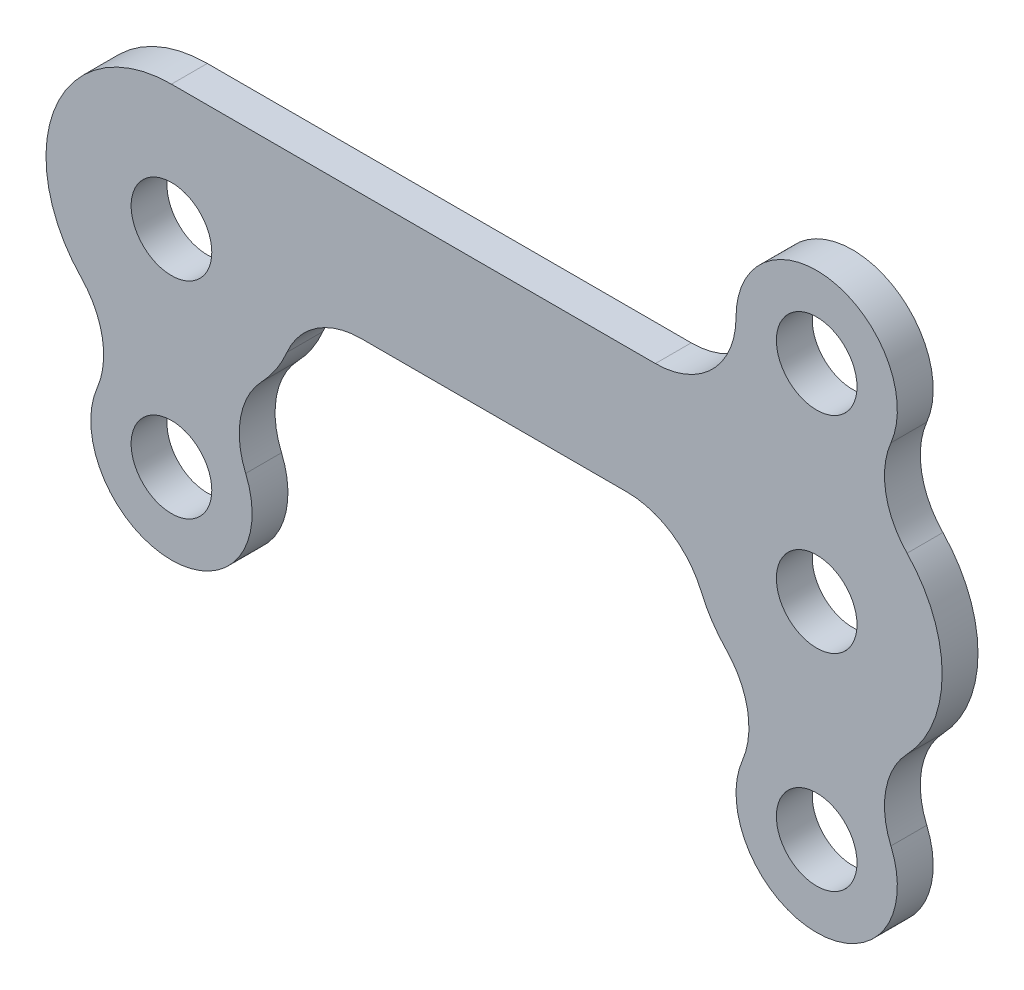
ISO-10303-21;
HEADER;
FILE_DESCRIPTION(('STEP AP214'),'2;1');
FILE_NAME('part.step','',(''),(''),'','','');
FILE_SCHEMA(('AUTOMOTIVE_DESIGN { 1 0 10303 214 1 1 1 1 }'));
ENDSEC;
DATA;
#1=APPLICATION_CONTEXT('core data for automotive mechanical design processes');
#2=APPLICATION_PROTOCOL_DEFINITION('international standard','automotive_design',2000,#1);
#3=PRODUCT_CONTEXT('',#1,'mechanical');
#4=PRODUCT('Part','Part','',(#3));
#5=PRODUCT_RELATED_PRODUCT_CATEGORY('part','',(#4));
#6=PRODUCT_DEFINITION_FORMATION('','',#4);
#7=PRODUCT_DEFINITION_CONTEXT('part definition',#1,'design');
#8=PRODUCT_DEFINITION('design','',#6,#7);
#9=PRODUCT_DEFINITION_SHAPE('','',#8);
#10=(LENGTH_UNIT() NAMED_UNIT(*) SI_UNIT(.MILLI.,.METRE.));
#11=(NAMED_UNIT(*) PLANE_ANGLE_UNIT() SI_UNIT($,.RADIAN.));
#12=(NAMED_UNIT(*) SI_UNIT($,.STERADIAN.) SOLID_ANGLE_UNIT());
#13=UNCERTAINTY_MEASURE_WITH_UNIT(LENGTH_MEASURE(1.E-05),#10,'distance_accuracy_value','');
#14=(GEOMETRIC_REPRESENTATION_CONTEXT(3) GLOBAL_UNCERTAINTY_ASSIGNED_CONTEXT((#13)) GLOBAL_UNIT_ASSIGNED_CONTEXT((#10,
#11,#12)) REPRESENTATION_CONTEXT('',''));
#15=CARTESIAN_POINT('',(0.,0.,0.));
#16=DIRECTION('',(0.,0.,1.));
#17=DIRECTION('',(1.,0.,0.));
#18=AXIS2_PLACEMENT_3D('',#15,#16,#17);
#19=CARTESIAN_POINT('',(35.149116844667,6.33274456521739,1.5875));
#20=DIRECTION('',(0.,0.,-1.));
#21=DIRECTION('',(-1.,0.,0.));
#22=AXIS2_PLACEMENT_3D('',#19,#20,#21);
#23=CYLINDRICAL_SURFACE('',#22,3.571875);
#24=CARTESIAN_POINT('',(35.149116844667,6.33274456521739,0.));
#25=DIRECTION('',(0.,0.,1.));
#26=DIRECTION('',(1.,0.,0.));
#27=AXIS2_PLACEMENT_3D('',#24,#25,#26);
#28=CIRCLE('',#27,3.571875);
#29=CARTESIAN_POINT('',(31.8620584223335,7.73043478260869,0.));
#30=VERTEX_POINT('',#29);
#31=CARTESIAN_POINT('',(32.5766363402321,3.8547140831758,0.));
#32=VERTEX_POINT('',#31);
#33=EDGE_CURVE('E166',#30,#32,#28,.T.);
#34=ORIENTED_EDGE('',*,*,#33,.F.);
#35=DIRECTION('',(0.,0.,-1.));
#36=VECTOR('',#35,1.);
#37=CARTESIAN_POINT('',(31.8620584223335,7.73043478260869,1.5875));
#38=LINE('',#37,#36);
#39=CARTESIAN_POINT('',(31.8620584223335,7.73043478260869,1.5875));
#40=VERTEX_POINT('',#39);
#41=EDGE_CURVE('E161',#40,#30,#38,.T.);
#42=ORIENTED_EDGE('',*,*,#41,.F.);
#43=CARTESIAN_POINT('',(35.149116844667,6.33274456521739,1.5875));
#44=DIRECTION('',(0.,0.,1.));
#45=DIRECTION('',(1.,0.,0.));
#46=AXIS2_PLACEMENT_3D('',#43,#44,#45);
#47=CIRCLE('',#46,3.571875);
#48=CARTESIAN_POINT('',(32.5766363402321,3.8547140831758,1.5875));
#49=VERTEX_POINT('',#48);
#50=EDGE_CURVE('E164',#40,#49,#47,.T.);
#51=ORIENTED_EDGE('',*,*,#50,.T.);
#52=DIRECTION('',(0.,0.,-1.));
#53=VECTOR('',#52,1.);
#54=CARTESIAN_POINT('',(32.5766363402321,3.8547140831758,1.5875));
#55=LINE('',#54,#53);
#56=EDGE_CURVE('E256',#49,#32,#55,.T.);
#57=ORIENTED_EDGE('',*,*,#56,.T.);
#58=EDGE_LOOP('',(#34,#42,#51,#57));
#59=FACE_BOUND('',#58,.T.);
#60=ADVANCED_FACE('F41',(#59),#23,.F.);
#61=CARTESIAN_POINT('',(28.575,9.128125,1.5875));
#62=DIRECTION('',(0.,0.,-1.));
#63=DIRECTION('',(-1.,0.,0.));
#64=AXIS2_PLACEMENT_3D('',#61,#62,#63);
#65=CYLINDRICAL_SURFACE('',#64,3.571875);
#66=CARTESIAN_POINT('',(28.575,9.128125,0.));
#67=DIRECTION('',(0.,0.,1.));
#68=DIRECTION('',(1.,0.,0.));
#69=AXIS2_PLACEMENT_3D('',#66,#67,#68);
#70=CIRCLE('',#69,3.571875);
#71=CARTESIAN_POINT('',(25.003125,9.128125,0.));
#72=VERTEX_POINT('',#71);
#73=EDGE_CURVE('E259',#30,#72,#70,.T.);
#74=ORIENTED_EDGE('',*,*,#73,.T.);
#75=DIRECTION('',(0.,0.,-1.));
#76=VECTOR('',#75,1.);
#77=CARTESIAN_POINT('',(25.003125,9.128125,1.5875));
#78=LINE('',#77,#76);
#79=CARTESIAN_POINT('',(25.003125,9.128125,1.5875));
#80=VERTEX_POINT('',#79);
#81=EDGE_CURVE('E172',#80,#72,#78,.T.);
#82=ORIENTED_EDGE('',*,*,#81,.F.);
#83=CARTESIAN_POINT('',(28.575,9.128125,1.5875));
#84=DIRECTION('',(0.,0.,1.));
#85=DIRECTION('',(1.,0.,0.));
#86=AXIS2_PLACEMENT_3D('',#83,#84,#85);
#87=CIRCLE('',#86,3.571875);
#88=EDGE_CURVE('E175',#40,#80,#87,.T.);
#89=ORIENTED_EDGE('',*,*,#88,.F.);
#90=ORIENTED_EDGE('',*,*,#41,.T.);
#91=EDGE_LOOP('',(#74,#82,#89,#90));
#92=FACE_BOUND('',#91,.T.);
#93=ADVANCED_FACE('F176',(#92),#65,.T.);
#94=CARTESIAN_POINT('',(21.43125,9.128125,1.5875));
#95=DIRECTION('',(0.,0.,-1.));
#96=DIRECTION('',(-1.,0.,0.));
#97=AXIS2_PLACEMENT_3D('',#94,#95,#96);
#98=CYLINDRICAL_SURFACE('',#97,3.571875);
#99=CARTESIAN_POINT('',(21.43125,9.128125,0.));
#100=DIRECTION('',(0.,0.,1.));
#101=DIRECTION('',(1.,0.,0.));
#102=AXIS2_PLACEMENT_3D('',#99,#100,#101);
#103=CIRCLE('',#102,3.571875);
#104=CARTESIAN_POINT('',(21.43125,5.55625,0.));
#105=VERTEX_POINT('',#104);
#106=EDGE_CURVE('E262',#105,#72,#103,.T.);
#107=ORIENTED_EDGE('',*,*,#106,.F.);
#108=DIRECTION('',(0.,0.,-1.));
#109=VECTOR('',#108,1.);
#110=CARTESIAN_POINT('',(21.43125,5.55625,1.5875));
#111=LINE('',#110,#109);
#112=CARTESIAN_POINT('',(21.43125,5.55625,1.5875));
#113=VERTEX_POINT('',#112);
#114=EDGE_CURVE('E352',#113,#105,#111,.T.);
#115=ORIENTED_EDGE('',*,*,#114,.F.);
#116=CARTESIAN_POINT('',(21.43125,9.128125,1.5875));
#117=DIRECTION('',(0.,0.,1.));
#118=DIRECTION('',(1.,0.,0.));
#119=AXIS2_PLACEMENT_3D('',#116,#117,#118);
#120=CIRCLE('',#119,3.571875);
#121=EDGE_CURVE('E181',#113,#80,#120,.T.);
#122=ORIENTED_EDGE('',*,*,#121,.T.);
#123=ORIENTED_EDGE('',*,*,#81,.T.);
#124=EDGE_LOOP('',(#107,#115,#122,#123));
#125=FACE_BOUND('',#124,.T.);
#126=ADVANCED_FACE('F417',(#125),#98,.F.);
#127=CARTESIAN_POINT('',(0.,5.55625,1.5875));
#128=DIRECTION('',(0.,1.,0.));
#129=DIRECTION('',(0.,0.,1.));
#130=AXIS2_PLACEMENT_3D('',#127,#128,#129);
#131=PLANE('',#130);
#132=DIRECTION('',(1.,0.,0.));
#133=VECTOR('',#132,1.);
#134=CARTESIAN_POINT('',(0.,5.55625,0.));
#135=LINE('',#134,#133);
#136=CARTESIAN_POINT('',(0.,5.55625,0.));
#137=VERTEX_POINT('',#136);
#138=EDGE_CURVE('E266',#137,#105,#135,.T.);
#139=ORIENTED_EDGE('',*,*,#138,.F.);
#140=DIRECTION('',(0.,0.,-1.));
#141=VECTOR('',#140,1.);
#142=CARTESIAN_POINT('',(0.,5.55625,1.5875));
#143=LINE('',#142,#141);
#144=CARTESIAN_POINT('',(0.,5.55625,1.5875));
#145=VERTEX_POINT('',#144);
#146=EDGE_CURVE('E349',#145,#137,#143,.T.);
#147=ORIENTED_EDGE('',*,*,#146,.F.);
#148=DIRECTION('',(1.,0.,0.));
#149=VECTOR('',#148,1.);
#150=CARTESIAN_POINT('',(0.,5.55625,1.5875));
#151=LINE('',#150,#149);
#152=EDGE_CURVE('E199',#145,#113,#151,.T.);
#153=ORIENTED_EDGE('',*,*,#152,.T.);
#154=ORIENTED_EDGE('',*,*,#114,.T.);
#155=EDGE_LOOP('',(#139,#147,#153,#154));
#156=FACE_BOUND('',#155,.T.);
#157=ADVANCED_FACE('F420',(#156),#131,.T.);
#158=CARTESIAN_POINT('',(0.,0.,1.5875));
#159=DIRECTION('',(0.,0.,-1.));
#160=DIRECTION('',(-1.,0.,0.));
#161=AXIS2_PLACEMENT_3D('',#158,#159,#160);
#162=CYLINDRICAL_SURFACE('',#161,5.55625);
#163=CARTESIAN_POINT('',(0.,0.,0.));
#164=DIRECTION('',(0.,0.,1.));
#165=DIRECTION('',(1.,0.,0.));
#166=AXIS2_PLACEMENT_3D('',#163,#164,#165);
#167=CIRCLE('',#166,5.55625);
#168=CARTESIAN_POINT('',(-4.0016363402321,-3.8547140831758,0.));
#169=VERTEX_POINT('',#168);
#170=EDGE_CURVE('E270',#137,#169,#167,.T.);
#171=ORIENTED_EDGE('',*,*,#170,.T.);
#172=DIRECTION('',(0.,0.,-1.));
#173=VECTOR('',#172,1.);
#174=CARTESIAN_POINT('',(-4.0016363402321,-3.8547140831758,1.5875));
#175=LINE('',#174,#173);
#176=CARTESIAN_POINT('',(-4.0016363402321,-3.8547140831758,1.5875));
#177=VERTEX_POINT('',#176);
#178=EDGE_CURVE('E346',#177,#169,#175,.T.);
#179=ORIENTED_EDGE('',*,*,#178,.F.);
#180=CARTESIAN_POINT('',(0.,0.,1.5875));
#181=DIRECTION('',(0.,0.,1.));
#182=DIRECTION('',(1.,0.,0.));
#183=AXIS2_PLACEMENT_3D('',#180,#181,#182);
#184=CIRCLE('',#183,5.55625);
#185=EDGE_CURVE('E203',#145,#177,#184,.T.);
#186=ORIENTED_EDGE('',*,*,#185,.F.);
#187=ORIENTED_EDGE('',*,*,#146,.T.);
#188=EDGE_LOOP('',(#171,#179,#186,#187));
#189=FACE_BOUND('',#188,.T.);
#190=ADVANCED_FACE('F424',(#189),#162,.T.);
#191=CARTESIAN_POINT('',(-6.57411684466701,-6.33274456521738,1.5875));
#192=DIRECTION('',(0.,0.,-1.));
#193=DIRECTION('',(-1.,0.,0.));
#194=AXIS2_PLACEMENT_3D('',#191,#192,#193);
#195=CYLINDRICAL_SURFACE('',#194,3.571875);
#196=CARTESIAN_POINT('',(-6.57411684466701,-6.33274456521738,0.));
#197=DIRECTION('',(0.,0.,1.));
#198=DIRECTION('',(1.,0.,0.));
#199=AXIS2_PLACEMENT_3D('',#196,#197,#198);
#200=CIRCLE('',#199,3.571875);
#201=CARTESIAN_POINT('',(-3.28705842233351,-7.73043478260869,0.));
#202=VERTEX_POINT('',#201);
#203=EDGE_CURVE('E274',#202,#169,#200,.T.);
#204=ORIENTED_EDGE('',*,*,#203,.F.);
#205=DIRECTION('',(0.,0.,-1.));
#206=VECTOR('',#205,1.);
#207=CARTESIAN_POINT('',(-3.28705842233351,-7.73043478260869,1.5875));
#208=LINE('',#207,#206);
#209=CARTESIAN_POINT('',(-3.28705842233351,-7.73043478260869,1.5875));
#210=VERTEX_POINT('',#209);
#211=EDGE_CURVE('E343',#210,#202,#208,.T.);
#212=ORIENTED_EDGE('',*,*,#211,.F.);
#213=CARTESIAN_POINT('',(-6.57411684466701,-6.33274456521738,1.5875));
#214=DIRECTION('',(0.,0.,1.));
#215=DIRECTION('',(1.,0.,0.));
#216=AXIS2_PLACEMENT_3D('',#213,#214,#215);
#217=CIRCLE('',#216,3.571875);
#218=EDGE_CURVE('E206',#210,#177,#217,.T.);
#219=ORIENTED_EDGE('',*,*,#218,.T.);
#220=ORIENTED_EDGE('',*,*,#178,.T.);
#221=EDGE_LOOP('',(#204,#212,#219,#220));
#222=FACE_BOUND('',#221,.T.);
#223=ADVANCED_FACE('F430',(#222),#195,.F.);
#224=CARTESIAN_POINT('',(0.,-9.128125,1.5875));
#225=DIRECTION('',(0.,0.,-1.));
#226=DIRECTION('',(-1.,0.,0.));
#227=AXIS2_PLACEMENT_3D('',#224,#225,#226);
#228=CYLINDRICAL_SURFACE('',#227,3.571875);
#229=CARTESIAN_POINT('',(0.,-9.128125,0.));
#230=DIRECTION('',(0.,0.,1.));
#231=DIRECTION('',(1.,0.,0.));
#232=AXIS2_PLACEMENT_3D('',#229,#230,#231);
#233=CIRCLE('',#232,3.571875);
#234=CARTESIAN_POINT('',(3.28705842233351,-7.73043478260869,0.));
#235=VERTEX_POINT('',#234);
#236=EDGE_CURVE('E279',#202,#235,#233,.T.);
#237=ORIENTED_EDGE('',*,*,#236,.T.);
#238=DIRECTION('',(0.,0.,-1.));
#239=VECTOR('',#238,1.);
#240=CARTESIAN_POINT('',(3.28705842233351,-7.73043478260869,1.5875));
#241=LINE('',#240,#239);
#242=CARTESIAN_POINT('',(3.28705842233351,-7.73043478260869,1.5875));
#243=VERTEX_POINT('',#242);
#244=EDGE_CURVE('E340',#243,#235,#241,.T.);
#245=ORIENTED_EDGE('',*,*,#244,.F.);
#246=CARTESIAN_POINT('',(0.,-9.128125,1.5875));
#247=DIRECTION('',(0.,0.,1.));
#248=DIRECTION('',(1.,0.,0.));
#249=AXIS2_PLACEMENT_3D('',#246,#247,#248);
#250=CIRCLE('',#249,3.571875);
#251=EDGE_CURVE('E211',#210,#243,#250,.T.);
#252=ORIENTED_EDGE('',*,*,#251,.F.);
#253=ORIENTED_EDGE('',*,*,#211,.T.);
#254=EDGE_LOOP('',(#237,#245,#252,#253));
#255=FACE_BOUND('',#254,.T.);
#256=ADVANCED_FACE('F433',(#255),#228,.T.);
#257=CARTESIAN_POINT('',(6.57411684466701,-6.33274456521738,1.5875));
#258=DIRECTION('',(0.,0.,-1.));
#259=DIRECTION('',(-1.,0.,0.));
#260=AXIS2_PLACEMENT_3D('',#257,#258,#259);
#261=CYLINDRICAL_SURFACE('',#260,3.571875);
#262=CARTESIAN_POINT('',(6.57411684466701,-6.33274456521738,0.));
#263=DIRECTION('',(0.,0.,1.));
#264=DIRECTION('',(1.,0.,0.));
#265=AXIS2_PLACEMENT_3D('',#262,#263,#264);
#266=CIRCLE('',#265,3.571875);
#267=CARTESIAN_POINT('',(4.0016363402321,-3.8547140831758,0.));
#268=VERTEX_POINT('',#267);
#269=EDGE_CURVE('E283',#268,#235,#266,.T.);
#270=ORIENTED_EDGE('',*,*,#269,.F.);
#271=DIRECTION('',(0.,0.,-1.));
#272=VECTOR('',#271,1.);
#273=CARTESIAN_POINT('',(4.0016363402321,-3.8547140831758,1.5875));
#274=LINE('',#273,#272);
#275=CARTESIAN_POINT('',(4.0016363402321,-3.8547140831758,1.5875));
#276=VERTEX_POINT('',#275);
#277=EDGE_CURVE('E337',#276,#268,#274,.T.);
#278=ORIENTED_EDGE('',*,*,#277,.F.);
#279=CARTESIAN_POINT('',(6.57411684466701,-6.33274456521738,1.5875));
#280=DIRECTION('',(0.,0.,1.));
#281=DIRECTION('',(1.,0.,0.));
#282=AXIS2_PLACEMENT_3D('',#279,#280,#281);
#283=CIRCLE('',#282,3.571875);
#284=EDGE_CURVE('E214',#276,#243,#283,.T.);
#285=ORIENTED_EDGE('',*,*,#284,.T.);
#286=ORIENTED_EDGE('',*,*,#244,.T.);
#287=EDGE_LOOP('',(#270,#278,#285,#286));
#288=FACE_BOUND('',#287,.T.);
#289=ADVANCED_FACE('F436',(#288),#261,.F.);
#290=CARTESIAN_POINT('',(5.11320199029657,-2.1741847826087,0.));
#291=VERTEX_POINT('',#290);
#292=EDGE_CURVE('E275',#268,#291,#167,.T.);
#293=ORIENTED_EDGE('',*,*,#292,.T.);
#294=DIRECTION('',(0.,0.,-1.));
#295=VECTOR('',#294,1.);
#296=CARTESIAN_POINT('',(5.11320199029657,-2.1741847826087,1.5875));
#297=LINE('',#296,#295);
#298=CARTESIAN_POINT('',(5.11320199029657,-2.1741847826087,1.5875));
#299=VERTEX_POINT('',#298);
#300=EDGE_CURVE('E57',#291,#299,#297,.F.);
#301=ORIENTED_EDGE('',*,*,#300,.T.);
#302=EDGE_CURVE('E207',#276,#299,#184,.T.);
#303=ORIENTED_EDGE('',*,*,#302,.F.);
#304=ORIENTED_EDGE('',*,*,#277,.T.);
#305=EDGE_LOOP('',(#293,#301,#303,#304));
#306=FACE_BOUND('',#305,.T.);
#307=ADVANCED_FACE('F437',(#306),#162,.T.);
#308=CARTESIAN_POINT('',(0.,0.,1.5875));
#309=DIRECTION('',(0.,1.,0.));
#310=DIRECTION('',(0.,0.,1.));
#311=AXIS2_PLACEMENT_3D('',#308,#309,#310);
#312=PLANE('',#311);
#313=DIRECTION('',(1.,0.,0.));
#314=VECTOR('',#313,1.);
#315=CARTESIAN_POINT('',(0.,0.,0.));
#316=LINE('',#315,#314);
#317=CARTESIAN_POINT('',(8.40026041263007,0.,0.));
#318=VERTEX_POINT('',#317);
#319=CARTESIAN_POINT('',(20.1747395873699,0.,0.));
#320=VERTEX_POINT('',#319);
#321=EDGE_CURVE('E287',#318,#320,#316,.T.);
#322=ORIENTED_EDGE('',*,*,#321,.T.);
#323=DIRECTION('',(0.,0.,1.));
#324=VECTOR('',#323,1.);
#325=CARTESIAN_POINT('',(20.1747395873699,0.,1.5875));
#326=LINE('',#325,#324);
#327=CARTESIAN_POINT('',(20.1747395873699,0.,1.5875));
#328=VERTEX_POINT('',#327);
#329=EDGE_CURVE('E364',#320,#328,#326,.T.);
#330=ORIENTED_EDGE('',*,*,#329,.T.);
#331=DIRECTION('',(1.,0.,0.));
#332=VECTOR('',#331,1.);
#333=CARTESIAN_POINT('',(0.,0.,1.5875));
#334=LINE('',#333,#332);
#335=CARTESIAN_POINT('',(8.40026041263007,0.,1.5875));
#336=VERTEX_POINT('',#335);
#337=EDGE_CURVE('E218',#336,#328,#334,.T.);
#338=ORIENTED_EDGE('',*,*,#337,.F.);
#339=DIRECTION('',(0.,0.,1.));
#340=VECTOR('',#339,1.);
#341=CARTESIAN_POINT('',(8.40026041263007,0.,0.));
#342=LINE('',#341,#340);
#343=EDGE_CURVE('E360',#336,#318,#342,.F.);
#344=ORIENTED_EDGE('',*,*,#343,.T.);
#345=EDGE_LOOP('',(#322,#330,#338,#344));
#346=FACE_BOUND('',#345,.T.);
#347=ADVANCED_FACE('F383',(#346),#312,.F.);
#348=CARTESIAN_POINT('',(28.575,0.,1.5875));
#349=DIRECTION('',(0.,0.,-1.));
#350=DIRECTION('',(-1.,0.,0.));
#351=AXIS2_PLACEMENT_3D('',#348,#349,#350);
#352=CYLINDRICAL_SURFACE('',#351,5.55625);
#353=CARTESIAN_POINT('',(28.575,0.,1.5875));
#354=DIRECTION('',(0.,0.,1.));
#355=DIRECTION('',(1.,0.,0.));
#356=AXIS2_PLACEMENT_3D('',#353,#354,#355);
#357=CIRCLE('',#356,5.55625);
#358=CARTESIAN_POINT('',(23.4617980097034,-2.1741847826087,1.5875));
#359=VERTEX_POINT('',#358);
#360=CARTESIAN_POINT('',(24.5733636597679,-3.8547140831758,1.5875));
#361=VERTEX_POINT('',#360);
#362=EDGE_CURVE('E222',#359,#361,#357,.T.);
#363=ORIENTED_EDGE('',*,*,#362,.F.);
#364=DIRECTION('',(0.,0.,-1.));
#365=VECTOR('',#364,1.);
#366=CARTESIAN_POINT('',(23.4617980097034,-2.1741847826087,1.5875));
#367=LINE('',#366,#365);
#368=CARTESIAN_POINT('',(23.4617980097034,-2.1741847826087,0.));
#369=VERTEX_POINT('',#368);
#370=EDGE_CURVE('E171',#359,#369,#367,.T.);
#371=ORIENTED_EDGE('',*,*,#370,.T.);
#372=CARTESIAN_POINT('',(28.575,0.,0.));
#373=DIRECTION('',(0.,0.,1.));
#374=DIRECTION('',(1.,0.,0.));
#375=AXIS2_PLACEMENT_3D('',#372,#373,#374);
#376=CIRCLE('',#375,5.55625);
#377=CARTESIAN_POINT('',(24.5733636597679,-3.8547140831758,0.));
#378=VERTEX_POINT('',#377);
#379=EDGE_CURVE('E291',#369,#378,#376,.T.);
#380=ORIENTED_EDGE('',*,*,#379,.T.);
#381=DIRECTION('',(0.,0.,-1.));
#382=VECTOR('',#381,1.);
#383=CARTESIAN_POINT('',(24.5733636597679,-3.8547140831758,1.5875));
#384=LINE('',#383,#382);
#385=EDGE_CURVE('E333',#361,#378,#384,.T.);
#386=ORIENTED_EDGE('',*,*,#385,.F.);
#387=EDGE_LOOP('',(#363,#371,#380,#386));
#388=FACE_BOUND('',#387,.T.);
#389=ADVANCED_FACE('F394',(#388),#352,.T.);
#390=CARTESIAN_POINT('',(22.000883155333,-6.33274456521739,1.5875));
#391=DIRECTION('',(0.,0.,-1.));
#392=DIRECTION('',(-1.,0.,0.));
#393=AXIS2_PLACEMENT_3D('',#390,#391,#392);
#394=CYLINDRICAL_SURFACE('',#393,3.571875);
#395=CARTESIAN_POINT('',(22.000883155333,-6.33274456521739,0.));
#396=DIRECTION('',(0.,0.,1.));
#397=DIRECTION('',(1.,0.,0.));
#398=AXIS2_PLACEMENT_3D('',#395,#396,#397);
#399=CIRCLE('',#398,3.571875);
#400=CARTESIAN_POINT('',(25.2879415776665,-7.7304347826087,0.));
#401=VERTEX_POINT('',#400);
#402=EDGE_CURVE('E294',#401,#378,#399,.T.);
#403=ORIENTED_EDGE('',*,*,#402,.F.);
#404=DIRECTION('',(0.,0.,-1.));
#405=VECTOR('',#404,1.);
#406=CARTESIAN_POINT('',(25.2879415776665,-7.7304347826087,1.5875));
#407=LINE('',#406,#405);
#408=CARTESIAN_POINT('',(25.2879415776665,-7.7304347826087,1.5875));
#409=VERTEX_POINT('',#408);
#410=EDGE_CURVE('E330',#409,#401,#407,.T.);
#411=ORIENTED_EDGE('',*,*,#410,.F.);
#412=CARTESIAN_POINT('',(22.000883155333,-6.33274456521739,1.5875));
#413=DIRECTION('',(0.,0.,1.));
#414=DIRECTION('',(1.,0.,0.));
#415=AXIS2_PLACEMENT_3D('',#412,#413,#414);
#416=CIRCLE('',#415,3.571875);
#417=EDGE_CURVE('E225',#409,#361,#416,.T.);
#418=ORIENTED_EDGE('',*,*,#417,.T.);
#419=ORIENTED_EDGE('',*,*,#385,.T.);
#420=EDGE_LOOP('',(#403,#411,#418,#419));
#421=FACE_BOUND('',#420,.T.);
#422=ADVANCED_FACE('F401',(#421),#394,.F.);
#423=CARTESIAN_POINT('',(28.575,-9.128125,1.5875));
#424=DIRECTION('',(0.,0.,-1.));
#425=DIRECTION('',(-1.,0.,0.));
#426=AXIS2_PLACEMENT_3D('',#423,#424,#425);
#427=CYLINDRICAL_SURFACE('',#426,3.57187499999999);
#428=CARTESIAN_POINT('',(28.575,-9.128125,0.));
#429=DIRECTION('',(0.,0.,1.));
#430=DIRECTION('',(1.,0.,0.));
#431=AXIS2_PLACEMENT_3D('',#428,#429,#430);
#432=CIRCLE('',#431,3.57187499999999);
#433=CARTESIAN_POINT('',(31.8620584223335,-7.73043478260869,0.));
#434=VERTEX_POINT('',#433);
#435=EDGE_CURVE('E299',#401,#434,#432,.T.);
#436=ORIENTED_EDGE('',*,*,#435,.T.);
#437=DIRECTION('',(0.,0.,-1.));
#438=VECTOR('',#437,1.);
#439=CARTESIAN_POINT('',(31.8620584223335,-7.73043478260869,1.5875));
#440=LINE('',#439,#438);
#441=CARTESIAN_POINT('',(31.8620584223335,-7.73043478260869,1.5875));
#442=VERTEX_POINT('',#441);
#443=EDGE_CURVE('E327',#442,#434,#440,.T.);
#444=ORIENTED_EDGE('',*,*,#443,.F.);
#445=CARTESIAN_POINT('',(28.575,-9.128125,1.5875));
#446=DIRECTION('',(0.,0.,1.));
#447=DIRECTION('',(1.,0.,0.));
#448=AXIS2_PLACEMENT_3D('',#445,#446,#447);
#449=CIRCLE('',#448,3.57187499999999);
#450=EDGE_CURVE('E229',#409,#442,#449,.T.);
#451=ORIENTED_EDGE('',*,*,#450,.F.);
#452=ORIENTED_EDGE('',*,*,#410,.T.);
#453=EDGE_LOOP('',(#436,#444,#451,#452));
#454=FACE_BOUND('',#453,.T.);
#455=ADVANCED_FACE('F404',(#454),#427,.T.);
#456=CARTESIAN_POINT('',(35.149116844667,-6.33274456521738,1.5875));
#457=DIRECTION('',(0.,0.,-1.));
#458=DIRECTION('',(-1.,0.,0.));
#459=AXIS2_PLACEMENT_3D('',#456,#457,#458);
#460=CYLINDRICAL_SURFACE('',#459,3.571875);
#461=CARTESIAN_POINT('',(35.149116844667,-6.33274456521738,0.));
#462=DIRECTION('',(0.,0.,1.));
#463=DIRECTION('',(1.,0.,0.));
#464=AXIS2_PLACEMENT_3D('',#461,#462,#463);
#465=CIRCLE('',#464,3.571875);
#466=CARTESIAN_POINT('',(32.5766363402321,-3.8547140831758,0.));
#467=VERTEX_POINT('',#466);
#468=EDGE_CURVE('E303',#467,#434,#465,.T.);
#469=ORIENTED_EDGE('',*,*,#468,.F.);
#470=DIRECTION('',(0.,0.,-1.));
#471=VECTOR('',#470,1.);
#472=CARTESIAN_POINT('',(32.5766363402321,-3.8547140831758,1.5875));
#473=LINE('',#472,#471);
#474=CARTESIAN_POINT('',(32.5766363402321,-3.8547140831758,1.5875));
#475=VERTEX_POINT('',#474);
#476=EDGE_CURVE('E324',#475,#467,#473,.T.);
#477=ORIENTED_EDGE('',*,*,#476,.F.);
#478=CARTESIAN_POINT('',(35.149116844667,-6.33274456521738,1.5875));
#479=DIRECTION('',(0.,0.,1.));
#480=DIRECTION('',(1.,0.,0.));
#481=AXIS2_PLACEMENT_3D('',#478,#479,#480);
#482=CIRCLE('',#481,3.571875);
#483=EDGE_CURVE('E232',#475,#442,#482,.T.);
#484=ORIENTED_EDGE('',*,*,#483,.T.);
#485=ORIENTED_EDGE('',*,*,#443,.T.);
#486=EDGE_LOOP('',(#469,#477,#484,#485));
#487=FACE_BOUND('',#486,.T.);
#488=ADVANCED_FACE('F407',(#487),#460,.F.);
#489=CARTESIAN_POINT('',(28.575,9.128125,1.5875));
#490=DIRECTION('',(0.,0.,-1.));
#491=DIRECTION('',(-1.,0.,0.));
#492=AXIS2_PLACEMENT_3D('',#489,#490,#491);
#493=CYLINDRICAL_SURFACE('',#492,1.7859375);
#494=CARTESIAN_POINT('',(28.575,9.128125,1.5875));
#495=DIRECTION('',(0.,0.,1.));
#496=DIRECTION('',(1.,0.,0.));
#497=AXIS2_PLACEMENT_3D('',#494,#495,#496);
#498=CIRCLE('',#497,1.7859375);
#499=CARTESIAN_POINT('',(30.3609375,9.128125,1.5875));
#500=VERTEX_POINT('',#499);
#501=EDGE_CURVE('E248',#500,#500,#498,.T.);
#502=ORIENTED_EDGE('',*,*,#501,.T.);
#503=EDGE_LOOP('',(#502));
#504=FACE_BOUND('',#503,.T.);
#505=CARTESIAN_POINT('',(28.575,9.128125,0.));
#506=DIRECTION('',(0.,0.,1.));
#507=DIRECTION('',(1.,0.,0.));
#508=AXIS2_PLACEMENT_3D('',#505,#506,#507);
#509=CIRCLE('',#508,1.7859375);
#510=CARTESIAN_POINT('',(30.3609375,9.128125,0.));
#511=VERTEX_POINT('',#510);
#512=EDGE_CURVE('E194',#511,#511,#509,.T.);
#513=ORIENTED_EDGE('',*,*,#512,.F.);
#514=EDGE_LOOP('',(#513));
#515=FACE_BOUND('',#514,.T.);
#516=ADVANCED_FACE('F470',(#504,#515),#493,.F.);
#517=CARTESIAN_POINT('',(0.,-9.128125,1.5875));
#518=DIRECTION('',(0.,0.,-1.));
#519=DIRECTION('',(-1.,0.,0.));
#520=AXIS2_PLACEMENT_3D('',#517,#518,#519);
#521=CYLINDRICAL_SURFACE('',#520,1.7859375);
#522=CARTESIAN_POINT('',(0.,-9.128125,1.5875));
#523=DIRECTION('',(0.,0.,1.));
#524=DIRECTION('',(1.,0.,0.));
#525=AXIS2_PLACEMENT_3D('',#522,#523,#524);
#526=CIRCLE('',#525,1.7859375);
#527=CARTESIAN_POINT('',(1.7859375,-9.128125,1.5875));
#528=VERTEX_POINT('',#527);
#529=EDGE_CURVE('E244',#528,#528,#526,.T.);
#530=ORIENTED_EDGE('',*,*,#529,.T.);
#531=EDGE_LOOP('',(#530));
#532=FACE_BOUND('',#531,.T.);
#533=CARTESIAN_POINT('',(0.,-9.128125,0.));
#534=DIRECTION('',(0.,0.,1.));
#535=DIRECTION('',(1.,0.,0.));
#536=AXIS2_PLACEMENT_3D('',#533,#534,#535);
#537=CIRCLE('',#536,1.7859375);
#538=CARTESIAN_POINT('',(1.7859375,-9.128125,0.));
#539=VERTEX_POINT('',#538);
#540=EDGE_CURVE('E315',#539,#539,#537,.T.);
#541=ORIENTED_EDGE('',*,*,#540,.F.);
#542=EDGE_LOOP('',(#541));
#543=FACE_BOUND('',#542,.T.);
#544=ADVANCED_FACE('F473',(#532,#543),#521,.F.);
#545=CARTESIAN_POINT('',(28.575,0.,1.5875));
#546=DIRECTION('',(0.,0.,-1.));
#547=DIRECTION('',(-1.,0.,0.));
#548=AXIS2_PLACEMENT_3D('',#545,#546,#547);
#549=CYLINDRICAL_SURFACE('',#548,1.7859375);
#550=CARTESIAN_POINT('',(28.575,0.,1.5875));
#551=DIRECTION('',(0.,0.,1.));
#552=DIRECTION('',(1.,0.,0.));
#553=AXIS2_PLACEMENT_3D('',#550,#551,#552);
#554=CIRCLE('',#553,1.7859375);
#555=CARTESIAN_POINT('',(30.3609375,0.,1.5875));
#556=VERTEX_POINT('',#555);
#557=EDGE_CURVE('E240',#556,#556,#554,.T.);
#558=ORIENTED_EDGE('',*,*,#557,.T.);
#559=EDGE_LOOP('',(#558));
#560=FACE_BOUND('',#559,.T.);
#561=CARTESIAN_POINT('',(28.575,0.,0.));
#562=DIRECTION('',(0.,0.,1.));
#563=DIRECTION('',(1.,0.,0.));
#564=AXIS2_PLACEMENT_3D('',#561,#562,#563);
#565=CIRCLE('',#564,1.7859375);
#566=CARTESIAN_POINT('',(30.3609375,0.,0.));
#567=VERTEX_POINT('',#566);
#568=EDGE_CURVE('E311',#567,#567,#565,.T.);
#569=ORIENTED_EDGE('',*,*,#568,.F.);
#570=EDGE_LOOP('',(#569));
#571=FACE_BOUND('',#570,.T.);
#572=ADVANCED_FACE('F477',(#560,#571),#549,.F.);
#573=CARTESIAN_POINT('',(0.,0.,1.5875));
#574=DIRECTION('',(0.,0.,-1.));
#575=DIRECTION('',(-1.,0.,0.));
#576=AXIS2_PLACEMENT_3D('',#573,#574,#575);
#577=CYLINDRICAL_SURFACE('',#576,1.7859375);
#578=CARTESIAN_POINT('',(0.,0.,1.5875));
#579=DIRECTION('',(0.,0.,1.));
#580=DIRECTION('',(1.,0.,0.));
#581=AXIS2_PLACEMENT_3D('',#578,#579,#580);
#582=CIRCLE('',#581,1.7859375);
#583=CARTESIAN_POINT('',(1.7859375,0.,1.5875));
#584=VERTEX_POINT('',#583);
#585=EDGE_CURVE('E236',#584,#584,#582,.T.);
#586=ORIENTED_EDGE('',*,*,#585,.T.);
#587=EDGE_LOOP('',(#586));
#588=FACE_BOUND('',#587,.T.);
#589=CARTESIAN_POINT('',(0.,0.,0.));
#590=DIRECTION('',(0.,0.,1.));
#591=DIRECTION('',(1.,0.,0.));
#592=AXIS2_PLACEMENT_3D('',#589,#590,#591);
#593=CIRCLE('',#592,1.7859375);
#594=CARTESIAN_POINT('',(1.7859375,0.,0.));
#595=VERTEX_POINT('',#594);
#596=EDGE_CURVE('E307',#595,#595,#593,.T.);
#597=ORIENTED_EDGE('',*,*,#596,.F.);
#598=EDGE_LOOP('',(#597));
#599=FACE_BOUND('',#598,.T.);
#600=ADVANCED_FACE('F481',(#588,#599),#577,.F.);
#601=EDGE_CURVE('E295',#467,#32,#376,.T.);
#602=ORIENTED_EDGE('',*,*,#601,.T.);
#603=ORIENTED_EDGE('',*,*,#56,.F.);
#604=EDGE_CURVE('E187',#475,#49,#357,.T.);
#605=ORIENTED_EDGE('',*,*,#604,.F.);
#606=ORIENTED_EDGE('',*,*,#476,.T.);
#607=EDGE_LOOP('',(#602,#603,#605,#606));
#608=FACE_BOUND('',#607,.T.);
#609=ADVANCED_FACE('F411',(#608),#352,.T.);
#610=CARTESIAN_POINT('',(28.575,-9.128125,1.5875));
#611=DIRECTION('',(0.,0.,-1.));
#612=DIRECTION('',(-1.,0.,0.));
#613=AXIS2_PLACEMENT_3D('',#610,#611,#612);
#614=CYLINDRICAL_SURFACE('',#613,1.7859375);
#615=CARTESIAN_POINT('',(28.575,-9.128125,1.5875));
#616=DIRECTION('',(0.,0.,1.));
#617=DIRECTION('',(1.,0.,0.));
#618=AXIS2_PLACEMENT_3D('',#615,#616,#617);
#619=CIRCLE('',#618,1.7859375);
#620=CARTESIAN_POINT('',(30.3609375,-9.128125,1.5875));
#621=VERTEX_POINT('',#620);
#622=EDGE_CURVE('E252',#621,#621,#619,.T.);
#623=ORIENTED_EDGE('',*,*,#622,.T.);
#624=EDGE_LOOP('',(#623));
#625=FACE_BOUND('',#624,.T.);
#626=CARTESIAN_POINT('',(28.575,-9.128125,0.));
#627=DIRECTION('',(0.,0.,1.));
#628=DIRECTION('',(1.,0.,0.));
#629=AXIS2_PLACEMENT_3D('',#626,#627,#628);
#630=CIRCLE('',#629,1.7859375);
#631=CARTESIAN_POINT('',(30.3609375,-9.128125,0.));
#632=VERTEX_POINT('',#631);
#633=EDGE_CURVE('E190',#632,#632,#630,.T.);
#634=ORIENTED_EDGE('',*,*,#633,.F.);
#635=EDGE_LOOP('',(#634));
#636=FACE_BOUND('',#635,.T.);
#637=ADVANCED_FACE('F464',(#625,#636),#614,.F.);
#638=CARTESIAN_POINT('',(0.,0.,1.5875));
#639=DIRECTION('',(0.,0.,1.));
#640=DIRECTION('',(1.,0.,0.));
#641=AXIS2_PLACEMENT_3D('',#638,#639,#640);
#642=PLANE('',#641);
#643=ORIENTED_EDGE('',*,*,#50,.F.);
#644=ORIENTED_EDGE('',*,*,#88,.T.);
#645=ORIENTED_EDGE('',*,*,#121,.F.);
#646=ORIENTED_EDGE('',*,*,#152,.F.);
#647=ORIENTED_EDGE('',*,*,#185,.T.);
#648=ORIENTED_EDGE('',*,*,#218,.F.);
#649=ORIENTED_EDGE('',*,*,#251,.T.);
#650=ORIENTED_EDGE('',*,*,#284,.F.);
#651=ORIENTED_EDGE('',*,*,#302,.T.);
#652=CARTESIAN_POINT('',(8.40026041263007,-3.571875,1.5875));
#653=DIRECTION('',(0.,0.,1.));
#654=DIRECTION('',(1.,0.,0.));
#655=AXIS2_PLACEMENT_3D('',#652,#653,#654);
#656=CIRCLE('',#655,3.571875);
#657=EDGE_CURVE('E11',#299,#336,#656,.F.);
#658=ORIENTED_EDGE('',*,*,#657,.T.);
#659=ORIENTED_EDGE('',*,*,#337,.T.);
#660=CARTESIAN_POINT('',(20.1747395873699,-3.571875,1.5875));
#661=DIRECTION('',(0.,0.,1.));
#662=DIRECTION('',(1.,0.,0.));
#663=AXIS2_PLACEMENT_3D('',#660,#661,#662);
#664=CIRCLE('',#663,3.571875);
#665=EDGE_CURVE('E372',#328,#359,#664,.F.);
#666=ORIENTED_EDGE('',*,*,#665,.T.);
#667=ORIENTED_EDGE('',*,*,#362,.T.);
#668=ORIENTED_EDGE('',*,*,#417,.F.);
#669=ORIENTED_EDGE('',*,*,#450,.T.);
#670=ORIENTED_EDGE('',*,*,#483,.F.);
#671=ORIENTED_EDGE('',*,*,#604,.T.);
#672=EDGE_LOOP('',(#643,#644,#645,#646,#647,#648,#649,#650,#651,#658,#659,#666,#667,#668,#669,
#670,#671));
#673=FACE_BOUND('',#672,.T.);
#674=ORIENTED_EDGE('',*,*,#585,.F.);
#675=EDGE_LOOP('',(#674));
#676=FACE_BOUND('',#675,.T.);
#677=ORIENTED_EDGE('',*,*,#557,.F.);
#678=EDGE_LOOP('',(#677));
#679=FACE_BOUND('',#678,.T.);
#680=ORIENTED_EDGE('',*,*,#529,.F.);
#681=EDGE_LOOP('',(#680));
#682=FACE_BOUND('',#681,.T.);
#683=ORIENTED_EDGE('',*,*,#501,.F.);
#684=EDGE_LOOP('',(#683));
#685=FACE_BOUND('',#684,.T.);
#686=ORIENTED_EDGE('',*,*,#622,.F.);
#687=EDGE_LOOP('',(#686));
#688=FACE_BOUND('',#687,.T.);
#689=ADVANCED_FACE('F183',(#673,#676,#679,#682,#685,#688),#642,.T.);
#690=CARTESIAN_POINT('',(0.,0.,0.));
#691=DIRECTION('',(0.,0.,1.));
#692=DIRECTION('',(1.,0.,0.));
#693=AXIS2_PLACEMENT_3D('',#690,#691,#692);
#694=PLANE('',#693);
#695=ORIENTED_EDGE('',*,*,#33,.T.);
#696=ORIENTED_EDGE('',*,*,#601,.F.);
#697=ORIENTED_EDGE('',*,*,#468,.T.);
#698=ORIENTED_EDGE('',*,*,#435,.F.);
#699=ORIENTED_EDGE('',*,*,#402,.T.);
#700=ORIENTED_EDGE('',*,*,#379,.F.);
#701=CARTESIAN_POINT('',(20.1747395873699,-3.571875,0.));
#702=DIRECTION('',(0.,0.,1.));
#703=DIRECTION('',(1.,0.,0.));
#704=AXIS2_PLACEMENT_3D('',#701,#702,#703);
#705=CIRCLE('',#704,3.571875);
#706=EDGE_CURVE('E369',#369,#320,#705,.T.);
#707=ORIENTED_EDGE('',*,*,#706,.T.);
#708=ORIENTED_EDGE('',*,*,#321,.F.);
#709=CARTESIAN_POINT('',(8.40026041263007,-3.571875,0.));
#710=DIRECTION('',(0.,0.,1.));
#711=DIRECTION('',(1.,0.,0.));
#712=AXIS2_PLACEMENT_3D('',#709,#710,#711);
#713=CIRCLE('',#712,3.571875);
#714=EDGE_CURVE('E50',#318,#291,#713,.T.);
#715=ORIENTED_EDGE('',*,*,#714,.T.);
#716=ORIENTED_EDGE('',*,*,#292,.F.);
#717=ORIENTED_EDGE('',*,*,#269,.T.);
#718=ORIENTED_EDGE('',*,*,#236,.F.);
#719=ORIENTED_EDGE('',*,*,#203,.T.);
#720=ORIENTED_EDGE('',*,*,#170,.F.);
#721=ORIENTED_EDGE('',*,*,#138,.T.);
#722=ORIENTED_EDGE('',*,*,#106,.T.);
#723=ORIENTED_EDGE('',*,*,#73,.F.);
#724=EDGE_LOOP('',(#695,#696,#697,#698,#699,#700,#707,#708,#715,#716,#717,#718,#719,#720,#721,
#722,#723));
#725=FACE_BOUND('',#724,.T.);
#726=ORIENTED_EDGE('',*,*,#596,.T.);
#727=EDGE_LOOP('',(#726));
#728=FACE_BOUND('',#727,.T.);
#729=ORIENTED_EDGE('',*,*,#568,.T.);
#730=EDGE_LOOP('',(#729));
#731=FACE_BOUND('',#730,.T.);
#732=ORIENTED_EDGE('',*,*,#540,.T.);
#733=EDGE_LOOP('',(#732));
#734=FACE_BOUND('',#733,.T.);
#735=ORIENTED_EDGE('',*,*,#512,.T.);
#736=EDGE_LOOP('',(#735));
#737=FACE_BOUND('',#736,.T.);
#738=ORIENTED_EDGE('',*,*,#633,.T.);
#739=EDGE_LOOP('',(#738));
#740=FACE_BOUND('',#739,.T.);
#741=ADVANCED_FACE('F385',(#725,#728,#731,#734,#737,#740),#694,.F.);
#742=CARTESIAN_POINT('',(20.1747395873699,-3.571875,1.5875));
#743=DIRECTION('',(0.,0.,-1.));
#744=DIRECTION('',(-1.,0.,0.));
#745=AXIS2_PLACEMENT_3D('',#742,#743,#744);
#746=CYLINDRICAL_SURFACE('',#745,3.571875);
#747=ORIENTED_EDGE('',*,*,#665,.F.);
#748=ORIENTED_EDGE('',*,*,#329,.F.);
#749=ORIENTED_EDGE('',*,*,#706,.F.);
#750=ORIENTED_EDGE('',*,*,#370,.F.);
#751=EDGE_LOOP('',(#747,#748,#749,#750));
#752=FACE_BOUND('',#751,.T.);
#753=ADVANCED_FACE('F391',(#752),#746,.F.);
#754=CARTESIAN_POINT('',(8.40026041263007,-3.571875,1.5875));
#755=DIRECTION('',(0.,0.,-1.));
#756=DIRECTION('',(-1.,0.,0.));
#757=AXIS2_PLACEMENT_3D('',#754,#755,#756);
#758=CYLINDRICAL_SURFACE('',#757,3.571875);
#759=ORIENTED_EDGE('',*,*,#657,.F.);
#760=ORIENTED_EDGE('',*,*,#300,.F.);
#761=ORIENTED_EDGE('',*,*,#714,.F.);
#762=ORIENTED_EDGE('',*,*,#343,.F.);
#763=EDGE_LOOP('',(#759,#760,#761,#762));
#764=FACE_BOUND('',#763,.T.);
#765=ADVANCED_FACE('F43',(#764),#758,.F.);
#766=CLOSED_SHELL('',(#60,#93,#126,#157,#190,#223,#256,#289,#307,#347,#389,#422,#455,#488,#516,
#544,#572,#600,#609,#637,#689,#741,#753,#765));
#767=MANIFOLD_SOLID_BREP('B2',#766);
#768=ADVANCED_BREP_SHAPE_REPRESENTATION('',(#18,#767),#14);
#769=SHAPE_DEFINITION_REPRESENTATION(#9,#768);
ENDSEC;
END-ISO-10303-21;
